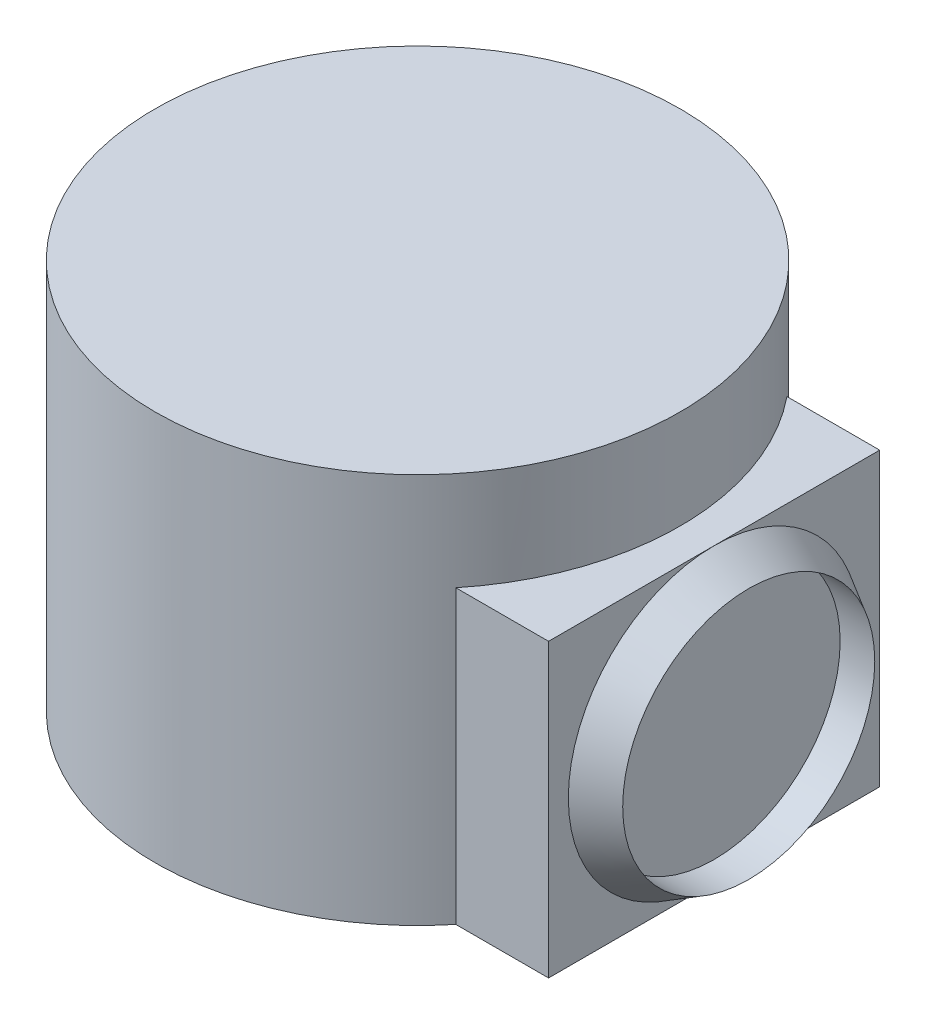
ISO-10303-21;
HEADER;
FILE_DESCRIPTION(('STEP AP214'),'2;1');
FILE_NAME('part.step','',(''),(''),'','','');
FILE_SCHEMA(('AUTOMOTIVE_DESIGN { 1 0 10303 214 1 1 1 1 }'));
ENDSEC;
DATA;
#1=APPLICATION_CONTEXT('core data for automotive mechanical design processes');
#2=APPLICATION_PROTOCOL_DEFINITION('international standard','automotive_design',2000,#1);
#3=PRODUCT_CONTEXT('',#1,'mechanical');
#4=PRODUCT('Part','Part','',(#3));
#5=PRODUCT_RELATED_PRODUCT_CATEGORY('part','',(#4));
#6=PRODUCT_DEFINITION_FORMATION('','',#4);
#7=PRODUCT_DEFINITION_CONTEXT('part definition',#1,'design');
#8=PRODUCT_DEFINITION('design','',#6,#7);
#9=PRODUCT_DEFINITION_SHAPE('','',#8);
#10=(LENGTH_UNIT() NAMED_UNIT(*) SI_UNIT(.MILLI.,.METRE.));
#11=(NAMED_UNIT(*) PLANE_ANGLE_UNIT() SI_UNIT($,.RADIAN.));
#12=(NAMED_UNIT(*) SI_UNIT($,.STERADIAN.) SOLID_ANGLE_UNIT());
#13=UNCERTAINTY_MEASURE_WITH_UNIT(LENGTH_MEASURE(1.E-05),#10,'distance_accuracy_value','');
#14=(GEOMETRIC_REPRESENTATION_CONTEXT(3) GLOBAL_UNCERTAINTY_ASSIGNED_CONTEXT((#13)) GLOBAL_UNIT_ASSIGNED_CONTEXT((#10,
#11,#12)) REPRESENTATION_CONTEXT('',''));
#15=CARTESIAN_POINT('',(0.,0.,0.));
#16=DIRECTION('',(0.,0.,1.));
#17=DIRECTION('',(1.,0.,0.));
#18=AXIS2_PLACEMENT_3D('',#15,#16,#17);
#19=CARTESIAN_POINT('',(0.,147.5,0.));
#20=DIRECTION('',(0.,1.,0.));
#21=DIRECTION('',(0.,0.,1.));
#22=AXIS2_PLACEMENT_3D('',#19,#20,#21);
#23=PLANE('',#22);
#24=DIRECTION('',(-1.,0.,0.));
#25=VECTOR('',#24,1.);
#26=CARTESIAN_POINT('',(150.,147.5,-83.75));
#27=LINE('',#26,#25);
#28=CARTESIAN_POINT('',(150.,147.5,-83.75));
#29=VERTEX_POINT('',#28);
#30=CARTESIAN_POINT('',(103.078114341746,147.5,-83.75));
#31=VERTEX_POINT('',#30);
#32=EDGE_CURVE('E108',#29,#31,#27,.T.);
#33=ORIENTED_EDGE('',*,*,#32,.T.);
#34=CARTESIAN_POINT('',(0.,147.5,0.));
#35=DIRECTION('',(0.,1.,0.));
#36=DIRECTION('',(0.,0.,1.));
#37=AXIS2_PLACEMENT_3D('',#34,#35,#36);
#38=CIRCLE('',#37,132.8125);
#39=CARTESIAN_POINT('',(103.078114341746,147.5,83.75));
#40=VERTEX_POINT('',#39);
#41=EDGE_CURVE('E103',#40,#31,#38,.T.);
#42=ORIENTED_EDGE('',*,*,#41,.F.);
#43=DIRECTION('',(-1.,0.,0.));
#44=VECTOR('',#43,1.);
#45=CARTESIAN_POINT('',(150.,147.5,83.75));
#46=LINE('',#45,#44);
#47=CARTESIAN_POINT('',(150.,147.5,83.75));
#48=VERTEX_POINT('',#47);
#49=EDGE_CURVE('E89',#48,#40,#46,.T.);
#50=ORIENTED_EDGE('',*,*,#49,.F.);
#51=DIRECTION('',(0.,0.,1.));
#52=VECTOR('',#51,1.);
#53=CARTESIAN_POINT('',(150.,147.5,-83.75));
#54=LINE('',#53,#52);
#55=CARTESIAN_POINT('',(150.,147.5,0.));
#56=VERTEX_POINT('',#55);
#57=EDGE_CURVE('E124',#56,#48,#54,.T.);
#58=ORIENTED_EDGE('',*,*,#57,.F.);
#59=EDGE_CURVE('E125',#29,#56,#54,.T.);
#60=ORIENTED_EDGE('',*,*,#59,.F.);
#61=EDGE_LOOP('',(#33,#42,#50,#58,#60));
#62=FACE_BOUND('',#61,.T.);
#63=ADVANCED_FACE('F39',(#62),#23,.T.);
#64=CARTESIAN_POINT('',(150.,0.,0.));
#65=DIRECTION('',(1.,0.,0.));
#66=DIRECTION('',(0.,0.,-1.));
#67=AXIS2_PLACEMENT_3D('',#64,#65,#66);
#68=PLANE('',#67);
#69=ORIENTED_EDGE('',*,*,#59,.T.);
#70=CARTESIAN_POINT('',(150.,73.75,0.));
#71=DIRECTION('',(-1.,0.,0.));
#72=DIRECTION('',(0.,0.,1.));
#73=AXIS2_PLACEMENT_3D('',#70,#71,#72);
#74=CIRCLE('',#73,73.75);
#75=CARTESIAN_POINT('',(150.,0.,0.));
#76=VERTEX_POINT('',#75);
#77=EDGE_CURVE('E51',#56,#76,#74,.T.);
#78=ORIENTED_EDGE('',*,*,#77,.T.);
#79=DIRECTION('',(0.,0.,-1.));
#80=VECTOR('',#79,1.);
#81=CARTESIAN_POINT('',(150.,0.,83.75));
#82=LINE('',#81,#80);
#83=CARTESIAN_POINT('',(150.,0.,-83.75));
#84=VERTEX_POINT('',#83);
#85=EDGE_CURVE('E131',#76,#84,#82,.T.);
#86=ORIENTED_EDGE('',*,*,#85,.T.);
#87=DIRECTION('',(0.,1.,0.));
#88=VECTOR('',#87,1.);
#89=CARTESIAN_POINT('',(150.,0.,-83.75));
#90=LINE('',#89,#88);
#91=EDGE_CURVE('E136',#84,#29,#90,.T.);
#92=ORIENTED_EDGE('',*,*,#91,.T.);
#93=EDGE_LOOP('',(#69,#78,#86,#92));
#94=FACE_BOUND('',#93,.T.);
#95=ADVANCED_FACE('F162',(#94),#68,.T.);
#96=CARTESIAN_POINT('',(0.,147.5,0.));
#97=DIRECTION('',(0.,-1.,0.));
#98=DIRECTION('',(0.,0.,-1.));
#99=AXIS2_PLACEMENT_3D('',#96,#97,#98);
#100=CYLINDRICAL_SURFACE('',#99,132.8125);
#101=DIRECTION('',(0.,-1.,0.));
#102=VECTOR('',#101,1.);
#103=CARTESIAN_POINT('',(103.078114341746,147.5,83.75));
#104=LINE('',#103,#102);
#105=CARTESIAN_POINT('',(103.078114341746,0.,83.75));
#106=VERTEX_POINT('',#105);
#107=EDGE_CURVE('E93',#40,#106,#104,.T.);
#108=ORIENTED_EDGE('',*,*,#107,.F.);
#109=ORIENTED_EDGE('',*,*,#41,.T.);
#110=DIRECTION('',(0.,-1.,0.));
#111=VECTOR('',#110,1.);
#112=CARTESIAN_POINT('',(103.078114341746,147.5,-83.75));
#113=LINE('',#112,#111);
#114=CARTESIAN_POINT('',(103.078114341746,0.,-83.75));
#115=VERTEX_POINT('',#114);
#116=EDGE_CURVE('E63',#115,#31,#113,.F.);
#117=ORIENTED_EDGE('',*,*,#116,.F.);
#118=CARTESIAN_POINT('',(0.,0.,0.));
#119=DIRECTION('',(0.,1.,0.));
#120=DIRECTION('',(0.,0.,1.));
#121=AXIS2_PLACEMENT_3D('',#118,#119,#120);
#122=CIRCLE('',#121,132.8125);
#123=EDGE_CURVE('E43',#115,#106,#122,.T.);
#124=ORIENTED_EDGE('',*,*,#123,.T.);
#125=EDGE_LOOP('',(#108,#109,#117,#124));
#126=FACE_BOUND('',#125,.T.);
#127=CARTESIAN_POINT('',(0.,197.5,0.));
#128=DIRECTION('',(0.,1.,0.));
#129=DIRECTION('',(0.,0.,1.));
#130=AXIS2_PLACEMENT_3D('',#127,#128,#129);
#131=CIRCLE('',#130,132.8125);
#132=CARTESIAN_POINT('',(0.,197.5,132.8125));
#133=VERTEX_POINT('',#132);
#134=EDGE_CURVE('E110',#133,#133,#131,.T.);
#135=ORIENTED_EDGE('',*,*,#134,.F.);
#136=EDGE_LOOP('',(#135));
#137=FACE_BOUND('',#136,.T.);
#138=ADVANCED_FACE('F41',(#126,#137),#100,.T.);
#139=CARTESIAN_POINT('',(0.,0.,0.));
#140=DIRECTION('',(0.,1.,0.));
#141=DIRECTION('',(0.,0.,1.));
#142=AXIS2_PLACEMENT_3D('',#139,#140,#141);
#143=PLANE('',#142);
#144=ORIENTED_EDGE('',*,*,#123,.F.);
#145=DIRECTION('',(-1.,0.,0.));
#146=VECTOR('',#145,1.);
#147=CARTESIAN_POINT('',(150.,0.,-83.75));
#148=LINE('',#147,#146);
#149=EDGE_CURVE('E141',#84,#115,#148,.T.);
#150=ORIENTED_EDGE('',*,*,#149,.F.);
#151=ORIENTED_EDGE('',*,*,#85,.F.);
#152=CARTESIAN_POINT('',(150.,0.,83.75));
#153=VERTEX_POINT('',#152);
#154=EDGE_CURVE('E132',#153,#76,#82,.T.);
#155=ORIENTED_EDGE('',*,*,#154,.F.);
#156=DIRECTION('',(-1.,0.,0.));
#157=VECTOR('',#156,1.);
#158=CARTESIAN_POINT('',(150.,0.,83.75));
#159=LINE('',#158,#157);
#160=EDGE_CURVE('E100',#153,#106,#159,.T.);
#161=ORIENTED_EDGE('',*,*,#160,.T.);
#162=EDGE_LOOP('',(#144,#150,#151,#155,#161));
#163=FACE_BOUND('',#162,.T.);
#164=ADVANCED_FACE('F154',(#163),#143,.F.);
#165=CARTESIAN_POINT('',(150.,147.5,83.75));
#166=DIRECTION('',(0.,0.,-1.));
#167=DIRECTION('',(0.,1.,0.));
#168=AXIS2_PLACEMENT_3D('',#165,#166,#167);
#169=PLANE('',#168);
#170=ORIENTED_EDGE('',*,*,#49,.T.);
#171=ORIENTED_EDGE('',*,*,#107,.T.);
#172=ORIENTED_EDGE('',*,*,#160,.F.);
#173=DIRECTION('',(0.,-1.,0.));
#174=VECTOR('',#173,1.);
#175=CARTESIAN_POINT('',(150.,147.5,83.75));
#176=LINE('',#175,#174);
#177=EDGE_CURVE('E95',#48,#153,#176,.T.);
#178=ORIENTED_EDGE('',*,*,#177,.F.);
#179=EDGE_LOOP('',(#170,#171,#172,#178));
#180=FACE_BOUND('',#179,.T.);
#181=ADVANCED_FACE('F91',(#180),#169,.F.);
#182=CARTESIAN_POINT('',(150.,0.,-83.75));
#183=DIRECTION('',(0.,0.,1.));
#184=DIRECTION('',(1.,0.,0.));
#185=AXIS2_PLACEMENT_3D('',#182,#183,#184);
#186=PLANE('',#185);
#187=ORIENTED_EDGE('',*,*,#149,.T.);
#188=ORIENTED_EDGE('',*,*,#116,.T.);
#189=ORIENTED_EDGE('',*,*,#32,.F.);
#190=ORIENTED_EDGE('',*,*,#91,.F.);
#191=EDGE_LOOP('',(#187,#188,#189,#190));
#192=FACE_BOUND('',#191,.T.);
#193=ADVANCED_FACE('F149',(#192),#186,.F.);
#194=ORIENTED_EDGE('',*,*,#154,.T.);
#195=EDGE_CURVE('E11',#76,#56,#74,.T.);
#196=ORIENTED_EDGE('',*,*,#195,.T.);
#197=ORIENTED_EDGE('',*,*,#57,.T.);
#198=ORIENTED_EDGE('',*,*,#177,.T.);
#199=EDGE_LOOP('',(#194,#196,#197,#198));
#200=FACE_BOUND('',#199,.T.);
#201=ADVANCED_FACE('F158',(#200),#68,.T.);
#202=CARTESIAN_POINT('',(150.,73.75,0.));
#203=DIRECTION('',(-1.,0.,0.));
#204=DIRECTION('',(0.,0.,1.));
#205=AXIS2_PLACEMENT_3D('',#202,#203,#204);
#206=CONICAL_SURFACE('',#205,73.75,0.519146114246523);
#207=CARTESIAN_POINT('',(167.5,73.75,0.));
#208=DIRECTION('',(-1.,0.,0.));
#209=DIRECTION('',(0.,0.,1.));
#210=AXIS2_PLACEMENT_3D('',#207,#208,#209);
#211=CIRCLE('',#210,63.75);
#212=CARTESIAN_POINT('',(167.5,73.75,63.75));
#213=VERTEX_POINT('',#212);
#214=EDGE_CURVE('E114',#213,#213,#211,.T.);
#215=ORIENTED_EDGE('',*,*,#214,.T.);
#216=EDGE_LOOP('',(#215));
#217=FACE_BOUND('',#216,.T.);
#218=ORIENTED_EDGE('',*,*,#77,.F.);
#219=ORIENTED_EDGE('',*,*,#195,.F.);
#220=EDGE_LOOP('',(#218,#219));
#221=FACE_BOUND('',#220,.T.);
#222=ADVANCED_FACE('F179',(#217,#221),#206,.T.);
#223=CARTESIAN_POINT('',(150.,73.75,0.));
#224=DIRECTION('',(-1.,0.,0.));
#225=DIRECTION('',(0.,0.,1.));
#226=AXIS2_PLACEMENT_3D('',#223,#224,#225);
#227=CYLINDRICAL_SURFACE('',#226,63.75);
#228=CARTESIAN_POINT('',(150.,73.75,0.));
#229=DIRECTION('',(-1.,0.,0.));
#230=DIRECTION('',(0.,0.,1.));
#231=AXIS2_PLACEMENT_3D('',#228,#229,#230);
#232=CIRCLE('',#231,63.75);
#233=CARTESIAN_POINT('',(150.,73.75,63.75));
#234=VERTEX_POINT('',#233);
#235=EDGE_CURVE('E49',#234,#234,#232,.T.);
#236=ORIENTED_EDGE('',*,*,#235,.T.);
#237=EDGE_LOOP('',(#236));
#238=FACE_BOUND('',#237,.T.);
#239=ORIENTED_EDGE('',*,*,#214,.F.);
#240=EDGE_LOOP('',(#239));
#241=FACE_BOUND('',#240,.T.);
#242=ADVANCED_FACE('F176',(#238,#241),#227,.F.);
#243=ORIENTED_EDGE('',*,*,#235,.F.);
#244=EDGE_LOOP('',(#243));
#245=FACE_BOUND('',#244,.T.);
#246=ADVANCED_FACE('F165',(#245),#68,.T.);
#247=CARTESIAN_POINT('',(0.,197.5,0.));
#248=DIRECTION('',(0.,1.,0.));
#249=DIRECTION('',(0.,0.,1.));
#250=AXIS2_PLACEMENT_3D('',#247,#248,#249);
#251=PLANE('',#250);
#252=ORIENTED_EDGE('',*,*,#134,.T.);
#253=EDGE_LOOP('',(#252));
#254=FACE_BOUND('',#253,.T.);
#255=ADVANCED_FACE('F175',(#254),#251,.T.);
#256=CLOSED_SHELL('',(#63,#95,#138,#164,#181,#193,#201,#222,#242,#246,#255));
#257=MANIFOLD_SOLID_BREP('B2',#256);
#258=ADVANCED_BREP_SHAPE_REPRESENTATION('',(#18,#257),#14);
#259=SHAPE_DEFINITION_REPRESENTATION(#9,#258);
ENDSEC;
END-ISO-10303-21;
